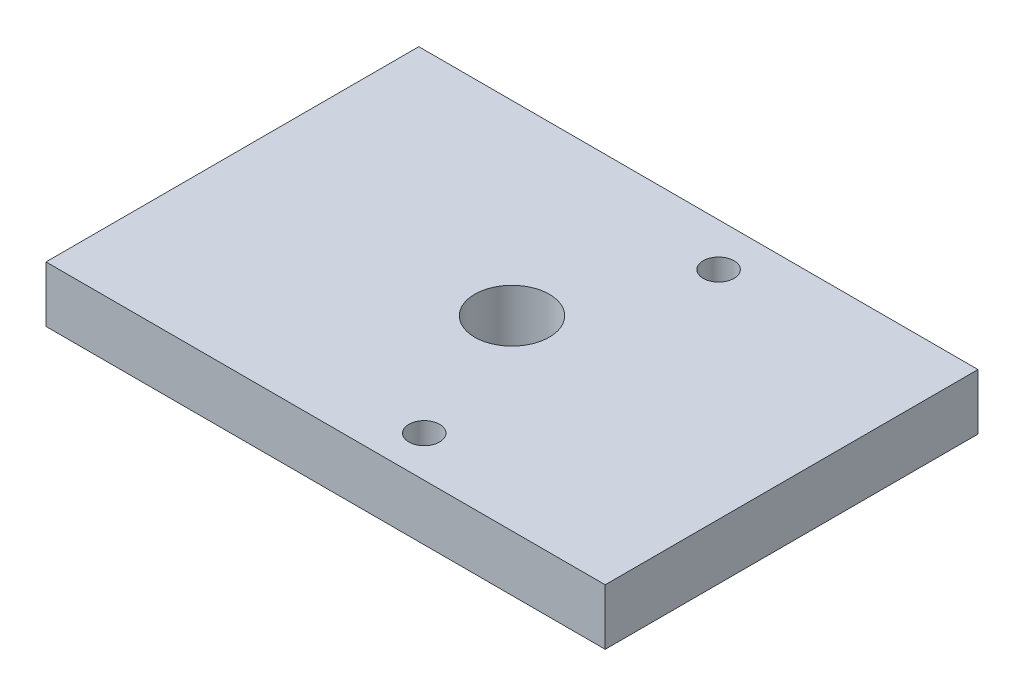
ISO-10303-21;
HEADER;
FILE_DESCRIPTION(('STEP AP214'),'2;1');
FILE_NAME('part.step','',(''),(''),'','','');
FILE_SCHEMA(('AUTOMOTIVE_DESIGN { 1 0 10303 214 1 1 1 1 }'));
ENDSEC;
DATA;
#1=APPLICATION_CONTEXT('core data for automotive mechanical design processes');
#2=APPLICATION_PROTOCOL_DEFINITION('international standard','automotive_design',2000,#1);
#3=PRODUCT_CONTEXT('',#1,'mechanical');
#4=PRODUCT('Part','Part','',(#3));
#5=PRODUCT_RELATED_PRODUCT_CATEGORY('part','',(#4));
#6=PRODUCT_DEFINITION_FORMATION('','',#4);
#7=PRODUCT_DEFINITION_CONTEXT('part definition',#1,'design');
#8=PRODUCT_DEFINITION('design','',#6,#7);
#9=PRODUCT_DEFINITION_SHAPE('','',#8);
#10=(LENGTH_UNIT() NAMED_UNIT(*) SI_UNIT(.MILLI.,.METRE.));
#11=(NAMED_UNIT(*) PLANE_ANGLE_UNIT() SI_UNIT($,.RADIAN.));
#12=(NAMED_UNIT(*) SI_UNIT($,.STERADIAN.) SOLID_ANGLE_UNIT());
#13=UNCERTAINTY_MEASURE_WITH_UNIT(LENGTH_MEASURE(1.E-05),#10,'distance_accuracy_value','');
#14=(GEOMETRIC_REPRESENTATION_CONTEXT(3) GLOBAL_UNCERTAINTY_ASSIGNED_CONTEXT((#13)) GLOBAL_UNIT_ASSIGNED_CONTEXT((#10,
#11,#12)) REPRESENTATION_CONTEXT('',''));
#15=CARTESIAN_POINT('',(0.,0.,0.));
#16=DIRECTION('',(0.,0.,1.));
#17=DIRECTION('',(1.,0.,0.));
#18=AXIS2_PLACEMENT_3D('',#15,#16,#17);
#19=CARTESIAN_POINT('',(0.,6.,0.));
#20=DIRECTION('',(0.,1.,0.));
#21=DIRECTION('',(0.,0.,1.));
#22=AXIS2_PLACEMENT_3D('',#19,#20,#21);
#23=PLANE('',#22);
#24=CARTESIAN_POINT('',(6.79508879872701,6.,-15.3729232164028));
#25=DIRECTION('',(0.,1.,0.));
#26=DIRECTION('',(0.,0.,1.));
#27=AXIS2_PLACEMENT_3D('',#24,#25,#26);
#28=CIRCLE('',#27,1.65);
#29=CARTESIAN_POINT('',(6.79508879872701,6.,-13.7229232164028));
#30=VERTEX_POINT('',#29);
#31=EDGE_CURVE('E109',#30,#30,#28,.T.);
#32=ORIENTED_EDGE('',*,*,#31,.F.);
#33=EDGE_LOOP('',(#32));
#34=FACE_BOUND('',#33,.T.);
#35=CARTESIAN_POINT('',(6.20253609188395,6.,15.6214130612079));
#36=DIRECTION('',(0.,1.,0.));
#37=DIRECTION('',(0.,0.,1.));
#38=AXIS2_PLACEMENT_3D('',#35,#36,#37);
#39=CIRCLE('',#38,1.65);
#40=CARTESIAN_POINT('',(6.20253609188395,6.,17.2714130612079));
#41=VERTEX_POINT('',#40);
#42=EDGE_CURVE('E115',#41,#41,#39,.T.);
#43=ORIENTED_EDGE('',*,*,#42,.F.);
#44=EDGE_LOOP('',(#43));
#45=FACE_BOUND('',#44,.T.);
#46=DIRECTION('',(0.,0.,-1.));
#47=VECTOR('',#46,1.);
#48=CARTESIAN_POINT('',(30.,6.,-20.));
#49=LINE('',#48,#47);
#50=CARTESIAN_POINT('',(30.,6.,20.));
#51=VERTEX_POINT('',#50);
#52=CARTESIAN_POINT('',(30.,6.,-20.));
#53=VERTEX_POINT('',#52);
#54=EDGE_CURVE('E86',#51,#53,#49,.T.);
#55=ORIENTED_EDGE('',*,*,#54,.T.);
#56=DIRECTION('',(-1.,0.,0.));
#57=VECTOR('',#56,1.);
#58=CARTESIAN_POINT('',(-30.,6.,-20.));
#59=LINE('',#58,#57);
#60=CARTESIAN_POINT('',(-30.,6.,-20.));
#61=VERTEX_POINT('',#60);
#62=EDGE_CURVE('E81',#53,#61,#59,.T.);
#63=ORIENTED_EDGE('',*,*,#62,.T.);
#64=DIRECTION('',(0.,0.,1.));
#65=VECTOR('',#64,1.);
#66=CARTESIAN_POINT('',(-30.,6.,-20.));
#67=LINE('',#66,#65);
#68=CARTESIAN_POINT('',(-30.,6.,20.));
#69=VERTEX_POINT('',#68);
#70=EDGE_CURVE('E84',#61,#69,#67,.T.);
#71=ORIENTED_EDGE('',*,*,#70,.T.);
#72=DIRECTION('',(1.,0.,0.));
#73=VECTOR('',#72,1.);
#74=CARTESIAN_POINT('',(-30.,6.,20.));
#75=LINE('',#74,#73);
#76=EDGE_CURVE('E51',#69,#51,#75,.T.);
#77=ORIENTED_EDGE('',*,*,#76,.T.);
#78=EDGE_LOOP('',(#55,#63,#71,#77));
#79=FACE_BOUND('',#78,.T.);
#80=CARTESIAN_POINT('',(0.,6.,0.));
#81=DIRECTION('',(0.,1.,0.));
#82=DIRECTION('',(0.,0.,1.));
#83=AXIS2_PLACEMENT_3D('',#80,#81,#82);
#84=CIRCLE('',#83,4.);
#85=CARTESIAN_POINT('',(0.,6.,4.00000000000001));
#86=VERTEX_POINT('',#85);
#87=EDGE_CURVE('E102',#86,#86,#84,.T.);
#88=ORIENTED_EDGE('',*,*,#87,.F.);
#89=EDGE_LOOP('',(#88));
#90=FACE_BOUND('',#89,.T.);
#91=ADVANCED_FACE('F32',(#34,#45,#79,#90),#23,.T.);
#92=CARTESIAN_POINT('',(0.,0.,0.));
#93=DIRECTION('',(0.,1.,0.));
#94=DIRECTION('',(0.,0.,1.));
#95=AXIS2_PLACEMENT_3D('',#92,#93,#94);
#96=PLANE('',#95);
#97=CARTESIAN_POINT('',(6.79508879872701,0.,-15.3729232164028));
#98=DIRECTION('',(0.,1.,0.));
#99=DIRECTION('',(0.,0.,1.));
#100=AXIS2_PLACEMENT_3D('',#97,#98,#99);
#101=CIRCLE('',#100,1.65);
#102=CARTESIAN_POINT('',(6.79508879872701,0.,-13.7229232164028));
#103=VERTEX_POINT('',#102);
#104=EDGE_CURVE('E36',#103,#103,#101,.T.);
#105=ORIENTED_EDGE('',*,*,#104,.T.);
#106=EDGE_LOOP('',(#105));
#107=FACE_BOUND('',#106,.T.);
#108=CARTESIAN_POINT('',(6.20253609188395,0.,15.6214130612079));
#109=DIRECTION('',(0.,1.,0.));
#110=DIRECTION('',(0.,0.,1.));
#111=AXIS2_PLACEMENT_3D('',#108,#109,#110);
#112=CIRCLE('',#111,1.65);
#113=CARTESIAN_POINT('',(6.20253609188395,0.,17.2714130612079));
#114=VERTEX_POINT('',#113);
#115=EDGE_CURVE('E107',#114,#114,#112,.T.);
#116=ORIENTED_EDGE('',*,*,#115,.T.);
#117=EDGE_LOOP('',(#116));
#118=FACE_BOUND('',#117,.T.);
#119=DIRECTION('',(0.,0.,-1.));
#120=VECTOR('',#119,1.);
#121=CARTESIAN_POINT('',(30.,0.,-20.));
#122=LINE('',#121,#120);
#123=CARTESIAN_POINT('',(30.,0.,20.));
#124=VERTEX_POINT('',#123);
#125=CARTESIAN_POINT('',(30.,0.,-20.));
#126=VERTEX_POINT('',#125);
#127=EDGE_CURVE('E99',#124,#126,#122,.T.);
#128=ORIENTED_EDGE('',*,*,#127,.F.);
#129=DIRECTION('',(1.,0.,0.));
#130=VECTOR('',#129,1.);
#131=CARTESIAN_POINT('',(-30.,0.,20.));
#132=LINE('',#131,#130);
#133=CARTESIAN_POINT('',(-30.,0.,20.));
#134=VERTEX_POINT('',#133);
#135=EDGE_CURVE('E74',#134,#124,#132,.T.);
#136=ORIENTED_EDGE('',*,*,#135,.F.);
#137=DIRECTION('',(0.,0.,1.));
#138=VECTOR('',#137,1.);
#139=CARTESIAN_POINT('',(-30.,0.,-20.));
#140=LINE('',#139,#138);
#141=CARTESIAN_POINT('',(-30.,0.,-20.));
#142=VERTEX_POINT('',#141);
#143=EDGE_CURVE('E68',#142,#134,#140,.T.);
#144=ORIENTED_EDGE('',*,*,#143,.F.);
#145=DIRECTION('',(-1.,0.,0.));
#146=VECTOR('',#145,1.);
#147=CARTESIAN_POINT('',(-30.,0.,-20.));
#148=LINE('',#147,#146);
#149=EDGE_CURVE('E90',#126,#142,#148,.T.);
#150=ORIENTED_EDGE('',*,*,#149,.F.);
#151=EDGE_LOOP('',(#128,#136,#144,#150));
#152=FACE_BOUND('',#151,.T.);
#153=CARTESIAN_POINT('',(0.,0.,0.));
#154=DIRECTION('',(0.,1.,0.));
#155=DIRECTION('',(0.,0.,1.));
#156=AXIS2_PLACEMENT_3D('',#153,#154,#155);
#157=CIRCLE('',#156,4.);
#158=CARTESIAN_POINT('',(0.,0.,4.00000000000001));
#159=VERTEX_POINT('',#158);
#160=EDGE_CURVE('E113',#159,#159,#157,.T.);
#161=ORIENTED_EDGE('',*,*,#160,.T.);
#162=EDGE_LOOP('',(#161));
#163=FACE_BOUND('',#162,.T.);
#164=ADVANCED_FACE('F127',(#107,#118,#152,#163),#96,.F.);
#165=CARTESIAN_POINT('',(30.,6.,-20.));
#166=DIRECTION('',(-1.,0.,0.));
#167=DIRECTION('',(0.,0.,1.));
#168=AXIS2_PLACEMENT_3D('',#165,#166,#167);
#169=PLANE('',#168);
#170=ORIENTED_EDGE('',*,*,#127,.T.);
#171=DIRECTION('',(0.,-1.,0.));
#172=VECTOR('',#171,1.);
#173=CARTESIAN_POINT('',(30.,6.,-20.));
#174=LINE('',#173,#172);
#175=EDGE_CURVE('E11',#53,#126,#174,.T.);
#176=ORIENTED_EDGE('',*,*,#175,.F.);
#177=ORIENTED_EDGE('',*,*,#54,.F.);
#178=DIRECTION('',(0.,-1.,0.));
#179=VECTOR('',#178,1.);
#180=CARTESIAN_POINT('',(30.,6.,20.));
#181=LINE('',#180,#179);
#182=EDGE_CURVE('E95',#51,#124,#181,.T.);
#183=ORIENTED_EDGE('',*,*,#182,.T.);
#184=EDGE_LOOP('',(#170,#176,#177,#183));
#185=FACE_BOUND('',#184,.T.);
#186=ADVANCED_FACE('F34',(#185),#169,.F.);
#187=CARTESIAN_POINT('',(-30.,6.,-20.));
#188=DIRECTION('',(0.,0.,1.));
#189=DIRECTION('',(1.,0.,0.));
#190=AXIS2_PLACEMENT_3D('',#187,#188,#189);
#191=PLANE('',#190);
#192=ORIENTED_EDGE('',*,*,#149,.T.);
#193=DIRECTION('',(0.,-1.,0.));
#194=VECTOR('',#193,1.);
#195=CARTESIAN_POINT('',(-30.,6.,-20.));
#196=LINE('',#195,#194);
#197=EDGE_CURVE('E42',#61,#142,#196,.T.);
#198=ORIENTED_EDGE('',*,*,#197,.F.);
#199=ORIENTED_EDGE('',*,*,#62,.F.);
#200=ORIENTED_EDGE('',*,*,#175,.T.);
#201=EDGE_LOOP('',(#192,#198,#199,#200));
#202=FACE_BOUND('',#201,.T.);
#203=ADVANCED_FACE('F89',(#202),#191,.F.);
#204=CARTESIAN_POINT('',(-30.,6.,-20.));
#205=DIRECTION('',(1.,0.,0.));
#206=DIRECTION('',(0.,0.,-1.));
#207=AXIS2_PLACEMENT_3D('',#204,#205,#206);
#208=PLANE('',#207);
#209=ORIENTED_EDGE('',*,*,#143,.T.);
#210=DIRECTION('',(0.,-1.,0.));
#211=VECTOR('',#210,1.);
#212=CARTESIAN_POINT('',(-30.,6.,20.));
#213=LINE('',#212,#211);
#214=EDGE_CURVE('E91',#69,#134,#213,.T.);
#215=ORIENTED_EDGE('',*,*,#214,.F.);
#216=ORIENTED_EDGE('',*,*,#70,.F.);
#217=ORIENTED_EDGE('',*,*,#197,.T.);
#218=EDGE_LOOP('',(#209,#215,#216,#217));
#219=FACE_BOUND('',#218,.T.);
#220=ADVANCED_FACE('F93',(#219),#208,.F.);
#221=CARTESIAN_POINT('',(-30.,6.,20.));
#222=DIRECTION('',(0.,0.,-1.));
#223=DIRECTION('',(-1.,0.,0.));
#224=AXIS2_PLACEMENT_3D('',#221,#222,#223);
#225=PLANE('',#224);
#226=ORIENTED_EDGE('',*,*,#135,.T.);
#227=ORIENTED_EDGE('',*,*,#182,.F.);
#228=ORIENTED_EDGE('',*,*,#76,.F.);
#229=ORIENTED_EDGE('',*,*,#214,.T.);
#230=EDGE_LOOP('',(#226,#227,#228,#229));
#231=FACE_BOUND('',#230,.T.);
#232=ADVANCED_FACE('F132',(#231),#225,.F.);
#233=CARTESIAN_POINT('',(0.,6.,0.));
#234=DIRECTION('',(0.,-1.,0.));
#235=DIRECTION('',(0.,0.,-1.));
#236=AXIS2_PLACEMENT_3D('',#233,#234,#235);
#237=CYLINDRICAL_SURFACE('',#236,4.);
#238=ORIENTED_EDGE('',*,*,#87,.T.);
#239=EDGE_LOOP('',(#238));
#240=FACE_BOUND('',#239,.T.);
#241=ORIENTED_EDGE('',*,*,#160,.F.);
#242=EDGE_LOOP('',(#241));
#243=FACE_BOUND('',#242,.T.);
#244=ADVANCED_FACE('F129',(#240,#243),#237,.F.);
#245=CARTESIAN_POINT('',(6.20253609188395,-4.,15.6214130612079));
#246=DIRECTION('',(0.,1.,0.));
#247=DIRECTION('',(0.,0.,1.));
#248=AXIS2_PLACEMENT_3D('',#245,#246,#247);
#249=CYLINDRICAL_SURFACE('',#248,1.65);
#250=ORIENTED_EDGE('',*,*,#42,.T.);
#251=EDGE_LOOP('',(#250));
#252=FACE_BOUND('',#251,.T.);
#253=ORIENTED_EDGE('',*,*,#115,.F.);
#254=EDGE_LOOP('',(#253));
#255=FACE_BOUND('',#254,.T.);
#256=ADVANCED_FACE('F131',(#252,#255),#249,.F.);
#257=CARTESIAN_POINT('',(6.79508879872701,-4.,-15.3729232164028));
#258=DIRECTION('',(0.,1.,0.));
#259=DIRECTION('',(0.,0.,1.));
#260=AXIS2_PLACEMENT_3D('',#257,#258,#259);
#261=CYLINDRICAL_SURFACE('',#260,1.65);
#262=ORIENTED_EDGE('',*,*,#31,.T.);
#263=EDGE_LOOP('',(#262));
#264=FACE_BOUND('',#263,.T.);
#265=ORIENTED_EDGE('',*,*,#104,.F.);
#266=EDGE_LOOP('',(#265));
#267=FACE_BOUND('',#266,.T.);
#268=ADVANCED_FACE('F139',(#264,#267),#261,.F.);
#269=CLOSED_SHELL('',(#91,#164,#186,#203,#220,#232,#244,#256,#268));
#270=MANIFOLD_SOLID_BREP('B2',#269);
#271=ADVANCED_BREP_SHAPE_REPRESENTATION('',(#18,#270),#14);
#272=SHAPE_DEFINITION_REPRESENTATION(#9,#271);
ENDSEC;
END-ISO-10303-21;
